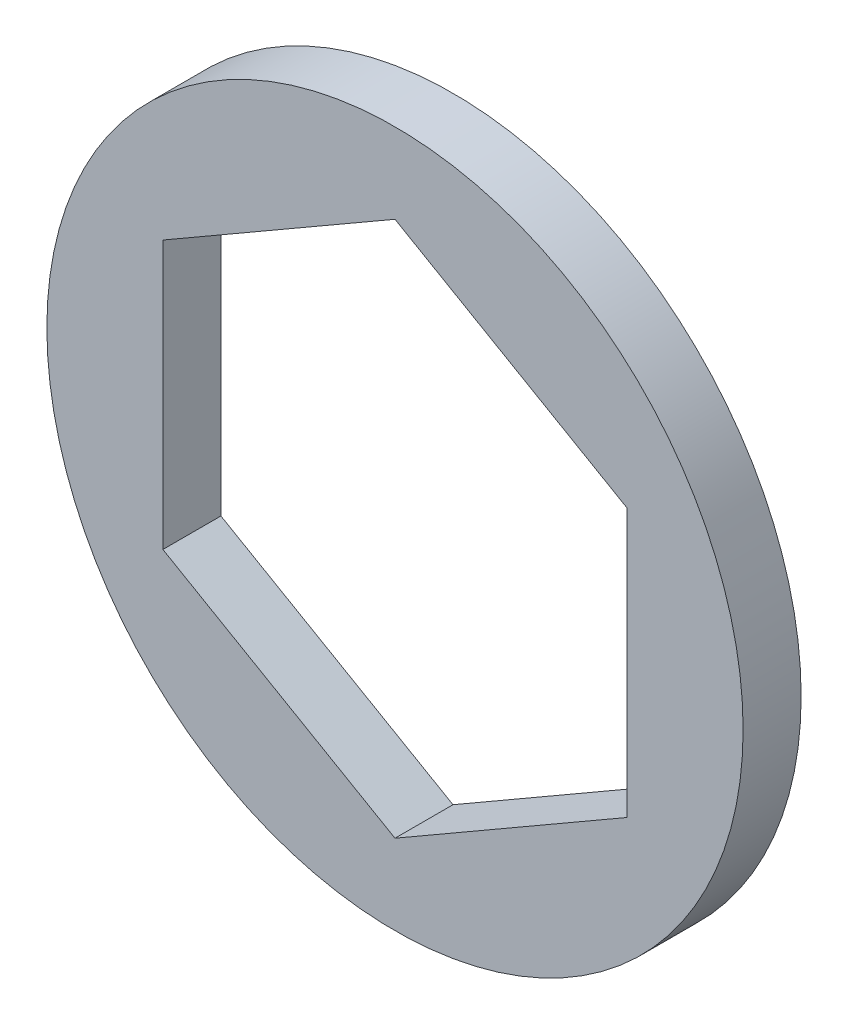
ISO-10303-21;
HEADER;
FILE_DESCRIPTION(('STEP AP214'),'2;1');
FILE_NAME('part.step','',(''),(''),'','','');
FILE_SCHEMA(('AUTOMOTIVE_DESIGN { 1 0 10303 214 1 1 1 1 }'));
ENDSEC;
DATA;
#1=APPLICATION_CONTEXT('core data for automotive mechanical design processes');
#2=APPLICATION_PROTOCOL_DEFINITION('international standard','automotive_design',2000,#1);
#3=PRODUCT_CONTEXT('',#1,'mechanical');
#4=PRODUCT('Part','Part','',(#3));
#5=PRODUCT_RELATED_PRODUCT_CATEGORY('part','',(#4));
#6=PRODUCT_DEFINITION_FORMATION('','',#4);
#7=PRODUCT_DEFINITION_CONTEXT('part definition',#1,'design');
#8=PRODUCT_DEFINITION('design','',#6,#7);
#9=PRODUCT_DEFINITION_SHAPE('','',#8);
#10=(LENGTH_UNIT() NAMED_UNIT(*) SI_UNIT(.MILLI.,.METRE.));
#11=(NAMED_UNIT(*) PLANE_ANGLE_UNIT() SI_UNIT($,.RADIAN.));
#12=(NAMED_UNIT(*) SI_UNIT($,.STERADIAN.) SOLID_ANGLE_UNIT());
#13=UNCERTAINTY_MEASURE_WITH_UNIT(LENGTH_MEASURE(1.E-05),#10,'distance_accuracy_value','');
#14=(GEOMETRIC_REPRESENTATION_CONTEXT(3) GLOBAL_UNCERTAINTY_ASSIGNED_CONTEXT((#13)) GLOBAL_UNIT_ASSIGNED_CONTEXT((#10,
#11,#12)) REPRESENTATION_CONTEXT('',''));
#15=CARTESIAN_POINT('',(0.,0.,0.));
#16=DIRECTION('',(0.,0.,1.));
#17=DIRECTION('',(1.,0.,0.));
#18=AXIS2_PLACEMENT_3D('',#15,#16,#17);
#19=CARTESIAN_POINT('',(0.,0.,1.5875));
#20=DIRECTION('',(0.,0.,1.));
#21=DIRECTION('',(1.,0.,0.));
#22=AXIS2_PLACEMENT_3D('',#19,#20,#21);
#23=PLANE('',#22);
#24=CARTESIAN_POINT('',(0.,0.,1.5875));
#25=DIRECTION('',(0.,0.,1.));
#26=DIRECTION('',(1.,0.,0.));
#27=AXIS2_PLACEMENT_3D('',#24,#25,#26);
#28=CIRCLE('',#27,9.525);
#29=CARTESIAN_POINT('',(9.525,0.,1.5875));
#30=VERTEX_POINT('',#29);
#31=EDGE_CURVE('E11',#30,#30,#28,.T.);
#32=ORIENTED_EDGE('',*,*,#31,.T.);
#33=EDGE_LOOP('',(#32));
#34=FACE_BOUND('',#33,.T.);
#35=DIRECTION('',(-0.866025403784439,-0.5,0.));
#36=VECTOR('',#35,1.);
#37=CARTESIAN_POINT('',(0.,7.33234841870825,1.5875));
#38=LINE('',#37,#36);
#39=CARTESIAN_POINT('',(0.,7.33234841870825,1.5875));
#40=VERTEX_POINT('',#39);
#41=CARTESIAN_POINT('',(-6.35,3.66617420935412,1.5875));
#42=VERTEX_POINT('',#41);
#43=EDGE_CURVE('E108',#40,#42,#38,.T.);
#44=ORIENTED_EDGE('',*,*,#43,.F.);
#45=DIRECTION('',(-0.866025403784439,0.5,0.));
#46=VECTOR('',#45,1.);
#47=CARTESIAN_POINT('',(6.35,3.66617420935412,1.5875));
#48=LINE('',#47,#46);
#49=CARTESIAN_POINT('',(6.35,3.66617420935412,1.5875));
#50=VERTEX_POINT('',#49);
#51=EDGE_CURVE('E99',#50,#40,#48,.T.);
#52=ORIENTED_EDGE('',*,*,#51,.F.);
#53=DIRECTION('',(0.,1.,0.));
#54=VECTOR('',#53,1.);
#55=CARTESIAN_POINT('',(6.35,-3.66617420935412,1.5875));
#56=LINE('',#55,#54);
#57=CARTESIAN_POINT('',(6.35,-3.66617420935412,1.5875));
#58=VERTEX_POINT('',#57);
#59=EDGE_CURVE('E133',#58,#50,#56,.T.);
#60=ORIENTED_EDGE('',*,*,#59,.F.);
#61=DIRECTION('',(0.866025403784439,0.5,0.));
#62=VECTOR('',#61,1.);
#63=CARTESIAN_POINT('',(0.,-7.33234841870825,1.5875));
#64=LINE('',#63,#62);
#65=CARTESIAN_POINT('',(0.,-7.33234841870825,1.5875));
#66=VERTEX_POINT('',#65);
#67=EDGE_CURVE('E130',#66,#58,#64,.T.);
#68=ORIENTED_EDGE('',*,*,#67,.F.);
#69=DIRECTION('',(0.866025403784439,-0.5,0.));
#70=VECTOR('',#69,1.);
#71=CARTESIAN_POINT('',(-6.35,-3.66617420935412,1.5875));
#72=LINE('',#71,#70);
#73=CARTESIAN_POINT('',(-6.35,-3.66617420935412,1.5875));
#74=VERTEX_POINT('',#73);
#75=EDGE_CURVE('E125',#74,#66,#72,.T.);
#76=ORIENTED_EDGE('',*,*,#75,.F.);
#77=DIRECTION('',(0.,-1.,0.));
#78=VECTOR('',#77,1.);
#79=CARTESIAN_POINT('',(-6.35,3.66617420935412,1.5875));
#80=LINE('',#79,#78);
#81=EDGE_CURVE('E121',#42,#74,#80,.T.);
#82=ORIENTED_EDGE('',*,*,#81,.F.);
#83=EDGE_LOOP('',(#44,#52,#60,#68,#76,#82));
#84=FACE_BOUND('',#83,.T.);
#85=ADVANCED_FACE('F45',(#34,#84),#23,.T.);
#86=CARTESIAN_POINT('',(0.,0.,0.));
#87=DIRECTION('',(0.,0.,1.));
#88=DIRECTION('',(1.,0.,0.));
#89=AXIS2_PLACEMENT_3D('',#86,#87,#88);
#90=PLANE('',#89);
#91=CARTESIAN_POINT('',(0.,0.,0.));
#92=DIRECTION('',(0.,0.,1.));
#93=DIRECTION('',(1.,0.,0.));
#94=AXIS2_PLACEMENT_3D('',#91,#92,#93);
#95=CIRCLE('',#94,9.525);
#96=CARTESIAN_POINT('',(9.525,0.,0.));
#97=VERTEX_POINT('',#96);
#98=EDGE_CURVE('E49',#97,#97,#95,.T.);
#99=ORIENTED_EDGE('',*,*,#98,.F.);
#100=EDGE_LOOP('',(#99));
#101=FACE_BOUND('',#100,.T.);
#102=DIRECTION('',(-0.866025403784439,0.5,0.));
#103=VECTOR('',#102,1.);
#104=CARTESIAN_POINT('',(6.35,3.66617420935412,0.));
#105=LINE('',#104,#103);
#106=CARTESIAN_POINT('',(6.35,3.66617420935412,0.));
#107=VERTEX_POINT('',#106);
#108=CARTESIAN_POINT('',(0.,7.33234841870825,0.));
#109=VERTEX_POINT('',#108);
#110=EDGE_CURVE('E69',#107,#109,#105,.T.);
#111=ORIENTED_EDGE('',*,*,#110,.T.);
#112=DIRECTION('',(-0.866025403784439,-0.5,0.));
#113=VECTOR('',#112,1.);
#114=CARTESIAN_POINT('',(0.,7.33234841870825,0.));
#115=LINE('',#114,#113);
#116=CARTESIAN_POINT('',(-6.35,3.66617420935412,0.));
#117=VERTEX_POINT('',#116);
#118=EDGE_CURVE('E115',#109,#117,#115,.T.);
#119=ORIENTED_EDGE('',*,*,#118,.T.);
#120=DIRECTION('',(0.,-1.,0.));
#121=VECTOR('',#120,1.);
#122=CARTESIAN_POINT('',(-6.35,3.66617420935412,0.));
#123=LINE('',#122,#121);
#124=CARTESIAN_POINT('',(-6.35,-3.66617420935412,0.));
#125=VERTEX_POINT('',#124);
#126=EDGE_CURVE('E140',#117,#125,#123,.T.);
#127=ORIENTED_EDGE('',*,*,#126,.T.);
#128=DIRECTION('',(0.866025403784439,-0.5,0.));
#129=VECTOR('',#128,1.);
#130=CARTESIAN_POINT('',(-6.35,-3.66617420935412,0.));
#131=LINE('',#130,#129);
#132=CARTESIAN_POINT('',(0.,-7.33234841870825,0.));
#133=VERTEX_POINT('',#132);
#134=EDGE_CURVE('E144',#125,#133,#131,.T.);
#135=ORIENTED_EDGE('',*,*,#134,.T.);
#136=DIRECTION('',(0.866025403784439,0.5,0.));
#137=VECTOR('',#136,1.);
#138=CARTESIAN_POINT('',(0.,-7.33234841870825,0.));
#139=LINE('',#138,#137);
#140=CARTESIAN_POINT('',(6.35,-3.66617420935412,0.));
#141=VERTEX_POINT('',#140);
#142=EDGE_CURVE('E148',#133,#141,#139,.T.);
#143=ORIENTED_EDGE('',*,*,#142,.T.);
#144=DIRECTION('',(0.,1.,0.));
#145=VECTOR('',#144,1.);
#146=CARTESIAN_POINT('',(6.35,-3.66617420935412,0.));
#147=LINE('',#146,#145);
#148=EDGE_CURVE('E109',#141,#107,#147,.T.);
#149=ORIENTED_EDGE('',*,*,#148,.T.);
#150=EDGE_LOOP('',(#111,#119,#127,#135,#143,#149));
#151=FACE_BOUND('',#150,.T.);
#152=ADVANCED_FACE('F172',(#101,#151),#90,.F.);
#153=CARTESIAN_POINT('',(0.,0.,1.5875));
#154=DIRECTION('',(0.,0.,-1.));
#155=DIRECTION('',(-1.,0.,0.));
#156=AXIS2_PLACEMENT_3D('',#153,#154,#155);
#157=CYLINDRICAL_SURFACE('',#156,9.525);
#158=ORIENTED_EDGE('',*,*,#31,.F.);
#159=EDGE_LOOP('',(#158));
#160=FACE_BOUND('',#159,.T.);
#161=ORIENTED_EDGE('',*,*,#98,.T.);
#162=EDGE_LOOP('',(#161));
#163=FACE_BOUND('',#162,.T.);
#164=ADVANCED_FACE('F47',(#160,#163),#157,.T.);
#165=CARTESIAN_POINT('',(6.35,3.66617420935412,1.5875));
#166=DIRECTION('',(-0.5,-0.866025403784439,0.));
#167=DIRECTION('',(0.866025403784439,-0.5,0.));
#168=AXIS2_PLACEMENT_3D('',#165,#166,#167);
#169=PLANE('',#168);
#170=ORIENTED_EDGE('',*,*,#110,.F.);
#171=DIRECTION('',(0.,0.,-1.));
#172=VECTOR('',#171,1.);
#173=CARTESIAN_POINT('',(6.35,3.66617420935412,1.5875));
#174=LINE('',#173,#172);
#175=EDGE_CURVE('E103',#50,#107,#174,.T.);
#176=ORIENTED_EDGE('',*,*,#175,.F.);
#177=ORIENTED_EDGE('',*,*,#51,.T.);
#178=DIRECTION('',(0.,0.,-1.));
#179=VECTOR('',#178,1.);
#180=CARTESIAN_POINT('',(0.,7.33234841870825,1.5875));
#181=LINE('',#180,#179);
#182=EDGE_CURVE('E102',#40,#109,#181,.T.);
#183=ORIENTED_EDGE('',*,*,#182,.T.);
#184=EDGE_LOOP('',(#170,#176,#177,#183));
#185=FACE_BOUND('',#184,.T.);
#186=ADVANCED_FACE('F101',(#185),#169,.T.);
#187=CARTESIAN_POINT('',(0.,7.33234841870825,1.5875));
#188=DIRECTION('',(0.5,-0.866025403784439,0.));
#189=DIRECTION('',(0.866025403784439,0.5,0.));
#190=AXIS2_PLACEMENT_3D('',#187,#188,#189);
#191=PLANE('',#190);
#192=ORIENTED_EDGE('',*,*,#118,.F.);
#193=ORIENTED_EDGE('',*,*,#182,.F.);
#194=ORIENTED_EDGE('',*,*,#43,.T.);
#195=DIRECTION('',(0.,0.,-1.));
#196=VECTOR('',#195,1.);
#197=CARTESIAN_POINT('',(-6.35,3.66617420935412,1.5875));
#198=LINE('',#197,#196);
#199=EDGE_CURVE('E117',#42,#117,#198,.T.);
#200=ORIENTED_EDGE('',*,*,#199,.T.);
#201=EDGE_LOOP('',(#192,#193,#194,#200));
#202=FACE_BOUND('',#201,.T.);
#203=ADVANCED_FACE('F112',(#202),#191,.T.);
#204=CARTESIAN_POINT('',(-6.35,3.66617420935412,1.5875));
#205=DIRECTION('',(1.,0.,0.));
#206=DIRECTION('',(0.,1.,0.));
#207=AXIS2_PLACEMENT_3D('',#204,#205,#206);
#208=PLANE('',#207);
#209=ORIENTED_EDGE('',*,*,#126,.F.);
#210=ORIENTED_EDGE('',*,*,#199,.F.);
#211=ORIENTED_EDGE('',*,*,#81,.T.);
#212=DIRECTION('',(0.,0.,-1.));
#213=VECTOR('',#212,1.);
#214=CARTESIAN_POINT('',(-6.35,-3.66617420935412,1.5875));
#215=LINE('',#214,#213);
#216=EDGE_CURVE('E162',#74,#125,#215,.T.);
#217=ORIENTED_EDGE('',*,*,#216,.T.);
#218=EDGE_LOOP('',(#209,#210,#211,#217));
#219=FACE_BOUND('',#218,.T.);
#220=ADVANCED_FACE('F168',(#219),#208,.T.);
#221=CARTESIAN_POINT('',(-6.35,-3.66617420935412,1.5875));
#222=DIRECTION('',(0.5,0.866025403784439,0.));
#223=DIRECTION('',(-0.866025403784439,0.5,0.));
#224=AXIS2_PLACEMENT_3D('',#221,#222,#223);
#225=PLANE('',#224);
#226=ORIENTED_EDGE('',*,*,#134,.F.);
#227=ORIENTED_EDGE('',*,*,#216,.F.);
#228=ORIENTED_EDGE('',*,*,#75,.T.);
#229=DIRECTION('',(0.,0.,-1.));
#230=VECTOR('',#229,1.);
#231=CARTESIAN_POINT('',(0.,-7.33234841870825,1.5875));
#232=LINE('',#231,#230);
#233=EDGE_CURVE('E159',#66,#133,#232,.T.);
#234=ORIENTED_EDGE('',*,*,#233,.T.);
#235=EDGE_LOOP('',(#226,#227,#228,#234));
#236=FACE_BOUND('',#235,.T.);
#237=ADVANCED_FACE('F180',(#236),#225,.T.);
#238=CARTESIAN_POINT('',(0.,-7.33234841870825,1.5875));
#239=DIRECTION('',(-0.5,0.866025403784439,0.));
#240=DIRECTION('',(-0.866025403784439,-0.5,0.));
#241=AXIS2_PLACEMENT_3D('',#238,#239,#240);
#242=PLANE('',#241);
#243=ORIENTED_EDGE('',*,*,#142,.F.);
#244=ORIENTED_EDGE('',*,*,#233,.F.);
#245=ORIENTED_EDGE('',*,*,#67,.T.);
#246=DIRECTION('',(0.,0.,-1.));
#247=VECTOR('',#246,1.);
#248=CARTESIAN_POINT('',(6.35,-3.66617420935412,1.5875));
#249=LINE('',#248,#247);
#250=EDGE_CURVE('E61',#58,#141,#249,.T.);
#251=ORIENTED_EDGE('',*,*,#250,.T.);
#252=EDGE_LOOP('',(#243,#244,#245,#251));
#253=FACE_BOUND('',#252,.T.);
#254=ADVANCED_FACE('F178',(#253),#242,.T.);
#255=CARTESIAN_POINT('',(6.35,-3.66617420935412,1.5875));
#256=DIRECTION('',(-1.,0.,0.));
#257=DIRECTION('',(0.,-1.,0.));
#258=AXIS2_PLACEMENT_3D('',#255,#256,#257);
#259=PLANE('',#258);
#260=ORIENTED_EDGE('',*,*,#148,.F.);
#261=ORIENTED_EDGE('',*,*,#250,.F.);
#262=ORIENTED_EDGE('',*,*,#59,.T.);
#263=ORIENTED_EDGE('',*,*,#175,.T.);
#264=EDGE_LOOP('',(#260,#261,#262,#263));
#265=FACE_BOUND('',#264,.T.);
#266=ADVANCED_FACE('F174',(#265),#259,.T.);
#267=CLOSED_SHELL('',(#85,#152,#164,#186,#203,#220,#237,#254,#266));
#268=MANIFOLD_SOLID_BREP('B2',#267);
#269=ADVANCED_BREP_SHAPE_REPRESENTATION('',(#18,#268),#14);
#270=SHAPE_DEFINITION_REPRESENTATION(#9,#269);
ENDSEC;
END-ISO-10303-21;
